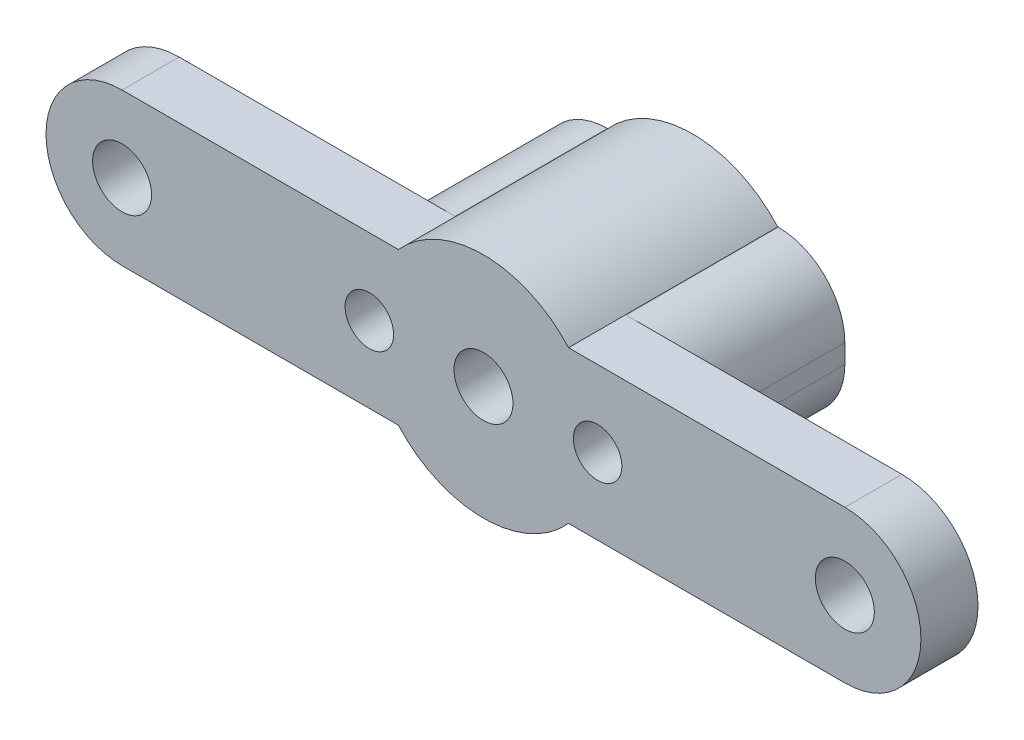
ISO-10303-21;
HEADER;
FILE_DESCRIPTION(('STEP AP214'),'2;1');
FILE_NAME('part.step','',(''),(''),'','','');
FILE_SCHEMA(('AUTOMOTIVE_DESIGN { 1 0 10303 214 1 1 1 1 }'));
ENDSEC;
DATA;
#1=APPLICATION_CONTEXT('core data for automotive mechanical design processes');
#2=APPLICATION_PROTOCOL_DEFINITION('international standard','automotive_design',2000,#1);
#3=PRODUCT_CONTEXT('',#1,'mechanical');
#4=PRODUCT('Part','Part','',(#3));
#5=PRODUCT_RELATED_PRODUCT_CATEGORY('part','',(#4));
#6=PRODUCT_DEFINITION_FORMATION('','',#4);
#7=PRODUCT_DEFINITION_CONTEXT('part definition',#1,'design');
#8=PRODUCT_DEFINITION('design','',#6,#7);
#9=PRODUCT_DEFINITION_SHAPE('','',#8);
#10=(LENGTH_UNIT() NAMED_UNIT(*) SI_UNIT(.MILLI.,.METRE.));
#11=(NAMED_UNIT(*) PLANE_ANGLE_UNIT() SI_UNIT($,.RADIAN.));
#12=(NAMED_UNIT(*) SI_UNIT($,.STERADIAN.) SOLID_ANGLE_UNIT());
#13=UNCERTAINTY_MEASURE_WITH_UNIT(LENGTH_MEASURE(1.E-05),#10,'distance_accuracy_value','');
#14=(GEOMETRIC_REPRESENTATION_CONTEXT(3) GLOBAL_UNCERTAINTY_ASSIGNED_CONTEXT((#13)) GLOBAL_UNIT_ASSIGNED_CONTEXT((#10,
#11,#12)) REPRESENTATION_CONTEXT('',''));
#15=CARTESIAN_POINT('',(0.,0.,0.));
#16=DIRECTION('',(0.,0.,1.));
#17=DIRECTION('',(1.,0.,0.));
#18=AXIS2_PLACEMENT_3D('',#15,#16,#17);
#19=CARTESIAN_POINT('',(-19.,0.,0.));
#20=DIRECTION('',(0.,0.,1.));
#21=DIRECTION('',(1.,0.,0.));
#22=AXIS2_PLACEMENT_3D('',#19,#20,#21);
#23=PLANE('',#22);
#24=CARTESIAN_POINT('',(-19.,0.,0.));
#25=DIRECTION('',(0.,0.,1.));
#26=DIRECTION('',(1.,0.,0.));
#27=AXIS2_PLACEMENT_3D('',#24,#25,#26);
#28=CIRCLE('',#27,1.55);
#29=CARTESIAN_POINT('',(-17.45,0.,0.));
#30=VERTEX_POINT('',#29);
#31=EDGE_CURVE('E315',#30,#30,#28,.T.);
#32=ORIENTED_EDGE('',*,*,#31,.T.);
#33=EDGE_LOOP('',(#32));
#34=FACE_BOUND('',#33,.T.);
#35=DIRECTION('',(0.,1.,0.));
#36=VECTOR('',#35,1.);
#37=CARTESIAN_POINT('',(-8.,4.,0.));
#38=LINE('',#37,#36);
#39=CARTESIAN_POINT('',(-8.,-0.5,0.));
#40=VERTEX_POINT('',#39);
#41=CARTESIAN_POINT('',(-8.,0.500000000000001,0.));
#42=VERTEX_POINT('',#41);
#43=EDGE_CURVE('E177',#40,#42,#38,.T.);
#44=ORIENTED_EDGE('',*,*,#43,.F.);
#45=CARTESIAN_POINT('',(-4.5,-0.5,0.));
#46=DIRECTION('',(0.,0.,1.));
#47=DIRECTION('',(1.,0.,0.));
#48=AXIS2_PLACEMENT_3D('',#45,#46,#47);
#49=CIRCLE('',#48,3.5);
#50=CARTESIAN_POINT('',(-4.5,-4.,0.));
#51=VERTEX_POINT('',#50);
#52=EDGE_CURVE('E217',#40,#51,#49,.T.);
#53=ORIENTED_EDGE('',*,*,#52,.T.);
#54=DIRECTION('',(1.,0.,0.));
#55=VECTOR('',#54,1.);
#56=CARTESIAN_POINT('',(-19.,-4.,0.));
#57=LINE('',#56,#55);
#58=CARTESIAN_POINT('',(-19.,-4.,0.));
#59=VERTEX_POINT('',#58);
#60=EDGE_CURVE('E223',#59,#51,#57,.T.);
#61=ORIENTED_EDGE('',*,*,#60,.F.);
#62=CARTESIAN_POINT('',(-19.,0.,0.));
#63=DIRECTION('',(0.,0.,1.));
#64=DIRECTION('',(1.,0.,0.));
#65=AXIS2_PLACEMENT_3D('',#62,#63,#64);
#66=CIRCLE('',#65,4.);
#67=CARTESIAN_POINT('',(-19.,4.,0.));
#68=VERTEX_POINT('',#67);
#69=EDGE_CURVE('E254',#68,#59,#66,.T.);
#70=ORIENTED_EDGE('',*,*,#69,.F.);
#71=DIRECTION('',(-1.,0.,0.));
#72=VECTOR('',#71,1.);
#73=CARTESIAN_POINT('',(-19.,4.,0.));
#74=LINE('',#73,#72);
#75=CARTESIAN_POINT('',(-4.5,4.,0.));
#76=VERTEX_POINT('',#75);
#77=EDGE_CURVE('E269',#76,#68,#74,.T.);
#78=ORIENTED_EDGE('',*,*,#77,.F.);
#79=CARTESIAN_POINT('',(-4.5,0.5,0.));
#80=DIRECTION('',(0.,0.,1.));
#81=DIRECTION('',(1.,0.,0.));
#82=AXIS2_PLACEMENT_3D('',#79,#80,#81);
#83=CIRCLE('',#82,3.5);
#84=EDGE_CURVE('E215',#76,#42,#83,.T.);
#85=ORIENTED_EDGE('',*,*,#84,.T.);
#86=EDGE_LOOP('',(#44,#53,#61,#70,#78,#85));
#87=FACE_BOUND('',#86,.T.);
#88=ADVANCED_FACE('F37',(#34,#87),#23,.F.);
#89=CARTESIAN_POINT('',(19.,0.,0.));
#90=DIRECTION('',(0.,0.,1.));
#91=DIRECTION('',(1.,0.,0.));
#92=AXIS2_PLACEMENT_3D('',#89,#90,#91);
#93=CIRCLE('',#92,1.55);
#94=CARTESIAN_POINT('',(20.55,0.,0.));
#95=VERTEX_POINT('',#94);
#96=EDGE_CURVE('E309',#95,#95,#93,.T.);
#97=ORIENTED_EDGE('',*,*,#96,.T.);
#98=EDGE_LOOP('',(#97));
#99=FACE_BOUND('',#98,.T.);
#100=DIRECTION('',(0.,-1.,0.));
#101=VECTOR('',#100,1.);
#102=CARTESIAN_POINT('',(8.,4.,0.));
#103=LINE('',#102,#101);
#104=CARTESIAN_POINT('',(8.,0.499999999999999,0.));
#105=VERTEX_POINT('',#104);
#106=CARTESIAN_POINT('',(8.,-0.5,0.));
#107=VERTEX_POINT('',#106);
#108=EDGE_CURVE('E180',#105,#107,#103,.T.);
#109=ORIENTED_EDGE('',*,*,#108,.F.);
#110=CARTESIAN_POINT('',(4.5,0.5,0.));
#111=DIRECTION('',(0.,0.,1.));
#112=DIRECTION('',(1.,0.,0.));
#113=AXIS2_PLACEMENT_3D('',#110,#111,#112);
#114=CIRCLE('',#113,3.5);
#115=CARTESIAN_POINT('',(4.5,4.,0.));
#116=VERTEX_POINT('',#115);
#117=EDGE_CURVE('E11',#105,#116,#114,.T.);
#118=ORIENTED_EDGE('',*,*,#117,.T.);
#119=DIRECTION('',(-1.,0.,0.));
#120=VECTOR('',#119,1.);
#121=CARTESIAN_POINT('',(4.47213595499958,4.,0.));
#122=LINE('',#121,#120);
#123=CARTESIAN_POINT('',(19.,4.,0.));
#124=VERTEX_POINT('',#123);
#125=EDGE_CURVE('E52',#124,#116,#122,.T.);
#126=ORIENTED_EDGE('',*,*,#125,.F.);
#127=CARTESIAN_POINT('',(19.,0.,0.));
#128=DIRECTION('',(0.,0.,1.));
#129=DIRECTION('',(1.,0.,0.));
#130=AXIS2_PLACEMENT_3D('',#127,#128,#129);
#131=CIRCLE('',#130,4.);
#132=CARTESIAN_POINT('',(19.,-4.,0.));
#133=VERTEX_POINT('',#132);
#134=EDGE_CURVE('E262',#133,#124,#131,.T.);
#135=ORIENTED_EDGE('',*,*,#134,.F.);
#136=DIRECTION('',(1.,0.,0.));
#137=VECTOR('',#136,1.);
#138=CARTESIAN_POINT('',(4.47213595499958,-4.,0.));
#139=LINE('',#138,#137);
#140=CARTESIAN_POINT('',(4.5,-4.,0.));
#141=VERTEX_POINT('',#140);
#142=EDGE_CURVE('E253',#141,#133,#139,.T.);
#143=ORIENTED_EDGE('',*,*,#142,.F.);
#144=CARTESIAN_POINT('',(4.5,-0.5,0.));
#145=DIRECTION('',(0.,0.,1.));
#146=DIRECTION('',(1.,0.,0.));
#147=AXIS2_PLACEMENT_3D('',#144,#145,#146);
#148=CIRCLE('',#147,3.5);
#149=EDGE_CURVE('E45',#141,#107,#148,.T.);
#150=ORIENTED_EDGE('',*,*,#149,.T.);
#151=EDGE_LOOP('',(#109,#118,#126,#135,#143,#150));
#152=FACE_BOUND('',#151,.T.);
#153=ADVANCED_FACE('F331',(#99,#152),#23,.F.);
#154=CARTESIAN_POINT('',(-19.,0.,3.));
#155=DIRECTION('',(0.,0.,1.));
#156=DIRECTION('',(1.,0.,0.));
#157=AXIS2_PLACEMENT_3D('',#154,#155,#156);
#158=PLANE('',#157);
#159=CARTESIAN_POINT('',(-6.,0.,3.));
#160=DIRECTION('',(0.,0.,1.));
#161=DIRECTION('',(1.,0.,0.));
#162=AXIS2_PLACEMENT_3D('',#159,#160,#161);
#163=CIRCLE('',#162,1.275);
#164=CARTESIAN_POINT('',(-4.725,0.,3.));
#165=VERTEX_POINT('',#164);
#166=EDGE_CURVE('E318',#165,#165,#163,.T.);
#167=ORIENTED_EDGE('',*,*,#166,.F.);
#168=EDGE_LOOP('',(#167));
#169=FACE_BOUND('',#168,.T.);
#170=CARTESIAN_POINT('',(19.,0.,3.));
#171=DIRECTION('',(0.,0.,1.));
#172=DIRECTION('',(1.,0.,0.));
#173=AXIS2_PLACEMENT_3D('',#170,#171,#172);
#174=CIRCLE('',#173,1.55);
#175=CARTESIAN_POINT('',(20.55,0.,3.));
#176=VERTEX_POINT('',#175);
#177=EDGE_CURVE('E308',#176,#176,#174,.T.);
#178=ORIENTED_EDGE('',*,*,#177,.F.);
#179=EDGE_LOOP('',(#178));
#180=FACE_BOUND('',#179,.T.);
#181=CARTESIAN_POINT('',(-19.,0.,3.));
#182=DIRECTION('',(0.,0.,1.));
#183=DIRECTION('',(1.,0.,0.));
#184=AXIS2_PLACEMENT_3D('',#181,#182,#183);
#185=CIRCLE('',#184,4.);
#186=CARTESIAN_POINT('',(-19.,4.,3.));
#187=VERTEX_POINT('',#186);
#188=CARTESIAN_POINT('',(-19.,-4.,3.));
#189=VERTEX_POINT('',#188);
#190=EDGE_CURVE('E271',#187,#189,#185,.T.);
#191=ORIENTED_EDGE('',*,*,#190,.T.);
#192=DIRECTION('',(1.,0.,0.));
#193=VECTOR('',#192,1.);
#194=CARTESIAN_POINT('',(-19.,-4.,3.));
#195=LINE('',#194,#193);
#196=CARTESIAN_POINT('',(-4.47213595499958,-4.,3.));
#197=VERTEX_POINT('',#196);
#198=EDGE_CURVE('E302',#189,#197,#195,.T.);
#199=ORIENTED_EDGE('',*,*,#198,.T.);
#200=CARTESIAN_POINT('',(0.,0.,3.));
#201=DIRECTION('',(0.,0.,1.));
#202=DIRECTION('',(1.,0.,0.));
#203=AXIS2_PLACEMENT_3D('',#200,#201,#202);
#204=CIRCLE('',#203,6.);
#205=CARTESIAN_POINT('',(4.47213595499958,-4.,3.));
#206=VERTEX_POINT('',#205);
#207=EDGE_CURVE('E300',#197,#206,#204,.T.);
#208=ORIENTED_EDGE('',*,*,#207,.T.);
#209=DIRECTION('',(1.,0.,0.));
#210=VECTOR('',#209,1.);
#211=CARTESIAN_POINT('',(4.47213595499958,-4.,3.));
#212=LINE('',#211,#210);
#213=CARTESIAN_POINT('',(19.,-4.,3.));
#214=VERTEX_POINT('',#213);
#215=EDGE_CURVE('E298',#206,#214,#212,.T.);
#216=ORIENTED_EDGE('',*,*,#215,.T.);
#217=CARTESIAN_POINT('',(19.,0.,3.));
#218=DIRECTION('',(0.,0.,1.));
#219=DIRECTION('',(1.,0.,0.));
#220=AXIS2_PLACEMENT_3D('',#217,#218,#219);
#221=CIRCLE('',#220,4.);
#222=CARTESIAN_POINT('',(19.,4.,3.));
#223=VERTEX_POINT('',#222);
#224=EDGE_CURVE('E296',#214,#223,#221,.T.);
#225=ORIENTED_EDGE('',*,*,#224,.T.);
#226=DIRECTION('',(-1.,0.,0.));
#227=VECTOR('',#226,1.);
#228=CARTESIAN_POINT('',(4.47213595499958,4.,3.));
#229=LINE('',#228,#227);
#230=CARTESIAN_POINT('',(4.47213595499958,4.,3.));
#231=VERTEX_POINT('',#230);
#232=EDGE_CURVE('E292',#223,#231,#229,.T.);
#233=ORIENTED_EDGE('',*,*,#232,.T.);
#234=CARTESIAN_POINT('',(0.,0.,3.));
#235=DIRECTION('',(0.,0.,1.));
#236=DIRECTION('',(1.,0.,0.));
#237=AXIS2_PLACEMENT_3D('',#234,#235,#236);
#238=CIRCLE('',#237,6.);
#239=CARTESIAN_POINT('',(-4.47213595499958,4.,3.));
#240=VERTEX_POINT('',#239);
#241=EDGE_CURVE('E157',#231,#240,#238,.T.);
#242=ORIENTED_EDGE('',*,*,#241,.T.);
#243=DIRECTION('',(-1.,0.,0.));
#244=VECTOR('',#243,1.);
#245=CARTESIAN_POINT('',(-19.,4.,3.));
#246=LINE('',#245,#244);
#247=EDGE_CURVE('E284',#240,#187,#246,.T.);
#248=ORIENTED_EDGE('',*,*,#247,.T.);
#249=EDGE_LOOP('',(#191,#199,#208,#216,#225,#233,#242,#248));
#250=FACE_BOUND('',#249,.T.);
#251=CARTESIAN_POINT('',(0.,0.,3.));
#252=DIRECTION('',(0.,0.,1.));
#253=DIRECTION('',(1.,0.,0.));
#254=AXIS2_PLACEMENT_3D('',#251,#252,#253);
#255=CIRCLE('',#254,1.55);
#256=CARTESIAN_POINT('',(1.55,0.,3.));
#257=VERTEX_POINT('',#256);
#258=EDGE_CURVE('E305',#257,#257,#255,.T.);
#259=ORIENTED_EDGE('',*,*,#258,.F.);
#260=EDGE_LOOP('',(#259));
#261=FACE_BOUND('',#260,.T.);
#262=CARTESIAN_POINT('',(-19.,0.,3.));
#263=DIRECTION('',(0.,0.,1.));
#264=DIRECTION('',(1.,0.,0.));
#265=AXIS2_PLACEMENT_3D('',#262,#263,#264);
#266=CIRCLE('',#265,1.55);
#267=CARTESIAN_POINT('',(-17.45,0.,3.));
#268=VERTEX_POINT('',#267);
#269=EDGE_CURVE('E312',#268,#268,#266,.T.);
#270=ORIENTED_EDGE('',*,*,#269,.F.);
#271=EDGE_LOOP('',(#270));
#272=FACE_BOUND('',#271,.T.);
#273=CARTESIAN_POINT('',(6.,0.,3.));
#274=DIRECTION('',(0.,0.,1.));
#275=DIRECTION('',(1.,0.,0.));
#276=AXIS2_PLACEMENT_3D('',#273,#274,#275);
#277=CIRCLE('',#276,1.275);
#278=CARTESIAN_POINT('',(7.275,0.,3.));
#279=VERTEX_POINT('',#278);
#280=EDGE_CURVE('E199',#279,#279,#277,.T.);
#281=ORIENTED_EDGE('',*,*,#280,.F.);
#282=EDGE_LOOP('',(#281));
#283=FACE_BOUND('',#282,.T.);
#284=ADVANCED_FACE('F328',(#169,#180,#250,#261,#272,#283),#158,.T.);
#285=CARTESIAN_POINT('',(-19.,0.,3.));
#286=DIRECTION('',(0.,0.,-1.));
#287=DIRECTION('',(-1.,0.,0.));
#288=AXIS2_PLACEMENT_3D('',#285,#286,#287);
#289=CYLINDRICAL_SURFACE('',#288,4.);
#290=ORIENTED_EDGE('',*,*,#69,.T.);
#291=DIRECTION('',(0.,0.,-1.));
#292=VECTOR('',#291,1.);
#293=CARTESIAN_POINT('',(-19.,-4.,3.));
#294=LINE('',#293,#292);
#295=EDGE_CURVE('E250',#189,#59,#294,.T.);
#296=ORIENTED_EDGE('',*,*,#295,.F.);
#297=ORIENTED_EDGE('',*,*,#190,.F.);
#298=DIRECTION('',(0.,0.,-1.));
#299=VECTOR('',#298,1.);
#300=CARTESIAN_POINT('',(-19.,4.,3.));
#301=LINE('',#300,#299);
#302=EDGE_CURVE('E282',#187,#68,#301,.T.);
#303=ORIENTED_EDGE('',*,*,#302,.T.);
#304=EDGE_LOOP('',(#290,#296,#297,#303));
#305=FACE_BOUND('',#304,.T.);
#306=ADVANCED_FACE('F330',(#305),#289,.T.);
#307=CARTESIAN_POINT('',(-19.,-4.,3.));
#308=DIRECTION('',(0.,1.,0.));
#309=DIRECTION('',(0.,0.,1.));
#310=AXIS2_PLACEMENT_3D('',#307,#308,#309);
#311=PLANE('',#310);
#312=ORIENTED_EDGE('',*,*,#60,.T.);
#313=DIRECTION('',(0.,0.,1.));
#314=VECTOR('',#313,1.);
#315=CARTESIAN_POINT('',(-4.5,-4.,3.));
#316=LINE('',#315,#314);
#317=CARTESIAN_POINT('',(-4.5,-4.,-8.));
#318=VERTEX_POINT('',#317);
#319=EDGE_CURVE('E229',#51,#318,#316,.F.);
#320=ORIENTED_EDGE('',*,*,#319,.T.);
#321=DIRECTION('',(-1.,0.,0.));
#322=VECTOR('',#321,1.);
#323=CARTESIAN_POINT('',(-4.47213595499958,-4.,-8.));
#324=LINE('',#323,#322);
#325=CARTESIAN_POINT('',(-4.47213595499958,-4.,-8.));
#326=VERTEX_POINT('',#325);
#327=EDGE_CURVE('E193',#326,#318,#324,.T.);
#328=ORIENTED_EDGE('',*,*,#327,.F.);
#329=DIRECTION('',(0.,0.,-1.));
#330=VECTOR('',#329,1.);
#331=CARTESIAN_POINT('',(-4.47213595499958,-4.,3.));
#332=LINE('',#331,#330);
#333=EDGE_CURVE('E273',#197,#326,#332,.T.);
#334=ORIENTED_EDGE('',*,*,#333,.F.);
#335=ORIENTED_EDGE('',*,*,#198,.F.);
#336=ORIENTED_EDGE('',*,*,#295,.T.);
#337=EDGE_LOOP('',(#312,#320,#328,#334,#335,#336));
#338=FACE_BOUND('',#337,.T.);
#339=ADVANCED_FACE('F338',(#338),#311,.F.);
#340=CARTESIAN_POINT('',(0.,0.,3.));
#341=DIRECTION('',(0.,0.,-1.));
#342=DIRECTION('',(-1.,0.,0.));
#343=AXIS2_PLACEMENT_3D('',#340,#341,#342);
#344=CYLINDRICAL_SURFACE('',#343,6.);
#345=ORIENTED_EDGE('',*,*,#333,.T.);
#346=CARTESIAN_POINT('',(0.,0.,-8.));
#347=DIRECTION('',(0.,0.,-1.));
#348=DIRECTION('',(-1.,0.,0.));
#349=AXIS2_PLACEMENT_3D('',#346,#347,#348);
#350=CIRCLE('',#349,6.);
#351=CARTESIAN_POINT('',(4.47213595499958,-4.,-8.));
#352=VERTEX_POINT('',#351);
#353=EDGE_CURVE('E190',#352,#326,#350,.T.);
#354=ORIENTED_EDGE('',*,*,#353,.F.);
#355=DIRECTION('',(0.,0.,-1.));
#356=VECTOR('',#355,1.);
#357=CARTESIAN_POINT('',(4.47213595499958,-4.,3.));
#358=LINE('',#357,#356);
#359=EDGE_CURVE('E275',#206,#352,#358,.T.);
#360=ORIENTED_EDGE('',*,*,#359,.F.);
#361=ORIENTED_EDGE('',*,*,#207,.F.);
#362=EDGE_LOOP('',(#345,#354,#360,#361));
#363=FACE_BOUND('',#362,.T.);
#364=ADVANCED_FACE('F366',(#363),#344,.T.);
#365=CARTESIAN_POINT('',(4.47213595499958,-4.,3.));
#366=DIRECTION('',(0.,1.,0.));
#367=DIRECTION('',(0.,0.,1.));
#368=AXIS2_PLACEMENT_3D('',#365,#366,#367);
#369=PLANE('',#368);
#370=DIRECTION('',(-1.,0.,0.));
#371=VECTOR('',#370,1.);
#372=CARTESIAN_POINT('',(8.,-4.,-8.));
#373=LINE('',#372,#371);
#374=CARTESIAN_POINT('',(4.5,-4.,-8.));
#375=VERTEX_POINT('',#374);
#376=EDGE_CURVE('E188',#375,#352,#373,.T.);
#377=ORIENTED_EDGE('',*,*,#376,.F.);
#378=DIRECTION('',(0.,0.,1.));
#379=VECTOR('',#378,1.);
#380=CARTESIAN_POINT('',(4.5,-4.,3.));
#381=LINE('',#380,#379);
#382=EDGE_CURVE('E207',#375,#141,#381,.T.);
#383=ORIENTED_EDGE('',*,*,#382,.T.);
#384=ORIENTED_EDGE('',*,*,#142,.T.);
#385=DIRECTION('',(0.,0.,-1.));
#386=VECTOR('',#385,1.);
#387=CARTESIAN_POINT('',(19.,-4.,3.));
#388=LINE('',#387,#386);
#389=EDGE_CURVE('E278',#214,#133,#388,.T.);
#390=ORIENTED_EDGE('',*,*,#389,.F.);
#391=ORIENTED_EDGE('',*,*,#215,.F.);
#392=ORIENTED_EDGE('',*,*,#359,.T.);
#393=EDGE_LOOP('',(#377,#383,#384,#390,#391,#392));
#394=FACE_BOUND('',#393,.T.);
#395=ADVANCED_FACE('F362',(#394),#369,.F.);
#396=CARTESIAN_POINT('',(19.,0.,3.));
#397=DIRECTION('',(0.,0.,-1.));
#398=DIRECTION('',(-1.,0.,0.));
#399=AXIS2_PLACEMENT_3D('',#396,#397,#398);
#400=CYLINDRICAL_SURFACE('',#399,4.);
#401=ORIENTED_EDGE('',*,*,#134,.T.);
#402=DIRECTION('',(0.,0.,-1.));
#403=VECTOR('',#402,1.);
#404=CARTESIAN_POINT('',(19.,4.,3.));
#405=LINE('',#404,#403);
#406=EDGE_CURVE('E159',#223,#124,#405,.T.);
#407=ORIENTED_EDGE('',*,*,#406,.F.);
#408=ORIENTED_EDGE('',*,*,#224,.F.);
#409=ORIENTED_EDGE('',*,*,#389,.T.);
#410=EDGE_LOOP('',(#401,#407,#408,#409));
#411=FACE_BOUND('',#410,.T.);
#412=ADVANCED_FACE('F359',(#411),#400,.T.);
#413=CARTESIAN_POINT('',(4.47213595499958,4.,3.));
#414=DIRECTION('',(0.,-1.,0.));
#415=DIRECTION('',(1.,0.,0.));
#416=AXIS2_PLACEMENT_3D('',#413,#414,#415);
#417=PLANE('',#416);
#418=ORIENTED_EDGE('',*,*,#125,.T.);
#419=DIRECTION('',(0.,0.,1.));
#420=VECTOR('',#419,1.);
#421=CARTESIAN_POINT('',(4.5,4.,3.));
#422=LINE('',#421,#420);
#423=CARTESIAN_POINT('',(4.5,4.,-8.));
#424=VERTEX_POINT('',#423);
#425=EDGE_CURVE('E166',#116,#424,#422,.F.);
#426=ORIENTED_EDGE('',*,*,#425,.T.);
#427=DIRECTION('',(1.,0.,0.));
#428=VECTOR('',#427,1.);
#429=CARTESIAN_POINT('',(8.,4.,-8.));
#430=LINE('',#429,#428);
#431=CARTESIAN_POINT('',(4.47213595499958,4.,-8.));
#432=VERTEX_POINT('',#431);
#433=EDGE_CURVE('E163',#432,#424,#430,.T.);
#434=ORIENTED_EDGE('',*,*,#433,.F.);
#435=DIRECTION('',(0.,0.,-1.));
#436=VECTOR('',#435,1.);
#437=CARTESIAN_POINT('',(4.47213595499958,4.,3.));
#438=LINE('',#437,#436);
#439=EDGE_CURVE('E151',#231,#432,#438,.T.);
#440=ORIENTED_EDGE('',*,*,#439,.F.);
#441=ORIENTED_EDGE('',*,*,#232,.F.);
#442=ORIENTED_EDGE('',*,*,#406,.T.);
#443=EDGE_LOOP('',(#418,#426,#434,#440,#441,#442));
#444=FACE_BOUND('',#443,.T.);
#445=ADVANCED_FACE('F164',(#444),#417,.F.);
#446=CARTESIAN_POINT('',(0.,0.,3.));
#447=DIRECTION('',(0.,0.,-1.));
#448=DIRECTION('',(-1.,0.,0.));
#449=AXIS2_PLACEMENT_3D('',#446,#447,#448);
#450=CYLINDRICAL_SURFACE('',#449,6.);
#451=ORIENTED_EDGE('',*,*,#439,.T.);
#452=CARTESIAN_POINT('',(0.,0.,-8.));
#453=DIRECTION('',(0.,0.,-1.));
#454=DIRECTION('',(-1.,0.,0.));
#455=AXIS2_PLACEMENT_3D('',#452,#453,#454);
#456=CIRCLE('',#455,6.);
#457=CARTESIAN_POINT('',(-4.47213595499958,4.,-8.));
#458=VERTEX_POINT('',#457);
#459=EDGE_CURVE('E156',#458,#432,#456,.T.);
#460=ORIENTED_EDGE('',*,*,#459,.F.);
#461=DIRECTION('',(0.,0.,-1.));
#462=VECTOR('',#461,1.);
#463=CARTESIAN_POINT('',(-4.47213595499958,4.,3.));
#464=LINE('',#463,#462);
#465=EDGE_CURVE('E160',#240,#458,#464,.T.);
#466=ORIENTED_EDGE('',*,*,#465,.F.);
#467=ORIENTED_EDGE('',*,*,#241,.F.);
#468=EDGE_LOOP('',(#451,#460,#466,#467));
#469=FACE_BOUND('',#468,.T.);
#470=ADVANCED_FACE('F153',(#469),#450,.T.);
#471=CARTESIAN_POINT('',(-19.,4.,3.));
#472=DIRECTION('',(0.,-1.,0.));
#473=DIRECTION('',(0.,0.,-1.));
#474=AXIS2_PLACEMENT_3D('',#471,#472,#473);
#475=PLANE('',#474);
#476=DIRECTION('',(1.,0.,0.));
#477=VECTOR('',#476,1.);
#478=CARTESIAN_POINT('',(-4.47213595499958,4.,-8.));
#479=LINE('',#478,#477);
#480=CARTESIAN_POINT('',(-4.5,4.,-8.));
#481=VERTEX_POINT('',#480);
#482=EDGE_CURVE('E175',#481,#458,#479,.T.);
#483=ORIENTED_EDGE('',*,*,#482,.F.);
#484=DIRECTION('',(0.,0.,1.));
#485=VECTOR('',#484,1.);
#486=CARTESIAN_POINT('',(-4.5,4.,3.));
#487=LINE('',#486,#485);
#488=EDGE_CURVE('E246',#481,#76,#487,.T.);
#489=ORIENTED_EDGE('',*,*,#488,.T.);
#490=ORIENTED_EDGE('',*,*,#77,.T.);
#491=ORIENTED_EDGE('',*,*,#302,.F.);
#492=ORIENTED_EDGE('',*,*,#247,.F.);
#493=ORIENTED_EDGE('',*,*,#465,.T.);
#494=EDGE_LOOP('',(#483,#489,#490,#491,#492,#493));
#495=FACE_BOUND('',#494,.T.);
#496=ADVANCED_FACE('F350',(#495),#475,.F.);
#497=CARTESIAN_POINT('',(0.,0.,3.));
#498=DIRECTION('',(0.,0.,-1.));
#499=DIRECTION('',(-1.,0.,0.));
#500=AXIS2_PLACEMENT_3D('',#497,#498,#499);
#501=CYLINDRICAL_SURFACE('',#500,1.55);
#502=ORIENTED_EDGE('',*,*,#258,.T.);
#503=EDGE_LOOP('',(#502));
#504=FACE_BOUND('',#503,.T.);
#505=CARTESIAN_POINT('',(0.,0.,-8.));
#506=DIRECTION('',(0.,0.,-1.));
#507=DIRECTION('',(-1.,0.,0.));
#508=AXIS2_PLACEMENT_3D('',#505,#506,#507);
#509=CIRCLE('',#508,1.55);
#510=CARTESIAN_POINT('',(-1.55,0.,-8.));
#511=VERTEX_POINT('',#510);
#512=EDGE_CURVE('E183',#511,#511,#509,.T.);
#513=ORIENTED_EDGE('',*,*,#512,.T.);
#514=EDGE_LOOP('',(#513));
#515=FACE_BOUND('',#514,.T.);
#516=ADVANCED_FACE('F353',(#504,#515),#501,.F.);
#517=CARTESIAN_POINT('',(19.,0.,3.));
#518=DIRECTION('',(0.,0.,-1.));
#519=DIRECTION('',(-1.,0.,0.));
#520=AXIS2_PLACEMENT_3D('',#517,#518,#519);
#521=CYLINDRICAL_SURFACE('',#520,1.55);
#522=ORIENTED_EDGE('',*,*,#177,.T.);
#523=EDGE_LOOP('',(#522));
#524=FACE_BOUND('',#523,.T.);
#525=ORIENTED_EDGE('',*,*,#96,.F.);
#526=EDGE_LOOP('',(#525));
#527=FACE_BOUND('',#526,.T.);
#528=ADVANCED_FACE('F424',(#524,#527),#521,.F.);
#529=CARTESIAN_POINT('',(-19.,0.,3.));
#530=DIRECTION('',(0.,0.,-1.));
#531=DIRECTION('',(-1.,0.,0.));
#532=AXIS2_PLACEMENT_3D('',#529,#530,#531);
#533=CYLINDRICAL_SURFACE('',#532,1.55);
#534=ORIENTED_EDGE('',*,*,#269,.T.);
#535=EDGE_LOOP('',(#534));
#536=FACE_BOUND('',#535,.T.);
#537=ORIENTED_EDGE('',*,*,#31,.F.);
#538=EDGE_LOOP('',(#537));
#539=FACE_BOUND('',#538,.T.);
#540=ADVANCED_FACE('F420',(#536,#539),#533,.F.);
#541=CARTESIAN_POINT('',(-6.,0.,3.));
#542=DIRECTION('',(0.,0.,-1.));
#543=DIRECTION('',(-1.,0.,0.));
#544=AXIS2_PLACEMENT_3D('',#541,#542,#543);
#545=CYLINDRICAL_SURFACE('',#544,1.275);
#546=ORIENTED_EDGE('',*,*,#166,.T.);
#547=EDGE_LOOP('',(#546));
#548=FACE_BOUND('',#547,.T.);
#549=CARTESIAN_POINT('',(-6.,0.,-8.));
#550=DIRECTION('',(0.,0.,-1.));
#551=DIRECTION('',(-1.,0.,0.));
#552=AXIS2_PLACEMENT_3D('',#549,#550,#551);
#553=CIRCLE('',#552,1.275);
#554=CARTESIAN_POINT('',(-7.275,0.,-8.));
#555=VERTEX_POINT('',#554);
#556=EDGE_CURVE('E438',#555,#555,#553,.T.);
#557=ORIENTED_EDGE('',*,*,#556,.T.);
#558=EDGE_LOOP('',(#557));
#559=FACE_BOUND('',#558,.T.);
#560=ADVANCED_FACE('F417',(#548,#559),#545,.F.);
#561=CARTESIAN_POINT('',(6.,0.,3.));
#562=DIRECTION('',(0.,0.,-1.));
#563=DIRECTION('',(-1.,0.,0.));
#564=AXIS2_PLACEMENT_3D('',#561,#562,#563);
#565=CYLINDRICAL_SURFACE('',#564,1.275);
#566=ORIENTED_EDGE('',*,*,#280,.T.);
#567=EDGE_LOOP('',(#566));
#568=FACE_BOUND('',#567,.T.);
#569=CARTESIAN_POINT('',(6.,0.,-8.));
#570=DIRECTION('',(0.,0.,-1.));
#571=DIRECTION('',(-1.,0.,0.));
#572=AXIS2_PLACEMENT_3D('',#569,#570,#571);
#573=CIRCLE('',#572,1.275);
#574=CARTESIAN_POINT('',(4.725,0.,-8.));
#575=VERTEX_POINT('',#574);
#576=EDGE_CURVE('E436',#575,#575,#573,.T.);
#577=ORIENTED_EDGE('',*,*,#576,.T.);
#578=EDGE_LOOP('',(#577));
#579=FACE_BOUND('',#578,.T.);
#580=ADVANCED_FACE('F325',(#568,#579),#565,.F.);
#581=CARTESIAN_POINT('',(0.,0.,-8.));
#582=DIRECTION('',(0.,0.,-1.));
#583=DIRECTION('',(-1.,0.,0.));
#584=AXIS2_PLACEMENT_3D('',#581,#582,#583);
#585=PLANE('',#584);
#586=ORIENTED_EDGE('',*,*,#576,.F.);
#587=EDGE_LOOP('',(#586));
#588=FACE_BOUND('',#587,.T.);
#589=DIRECTION('',(0.,1.,0.));
#590=VECTOR('',#589,1.);
#591=CARTESIAN_POINT('',(-8.,4.,-8.));
#592=LINE('',#591,#590);
#593=CARTESIAN_POINT('',(-8.,-0.5,-8.));
#594=VERTEX_POINT('',#593);
#595=CARTESIAN_POINT('',(-8.,0.500000000000001,-8.));
#596=VERTEX_POINT('',#595);
#597=EDGE_CURVE('E196',#594,#596,#592,.T.);
#598=ORIENTED_EDGE('',*,*,#597,.T.);
#599=CARTESIAN_POINT('',(-4.5,0.5,-8.));
#600=DIRECTION('',(0.,0.,-1.));
#601=DIRECTION('',(-1.,0.,0.));
#602=AXIS2_PLACEMENT_3D('',#599,#600,#601);
#603=CIRCLE('',#602,3.5);
#604=EDGE_CURVE('E234',#596,#481,#603,.T.);
#605=ORIENTED_EDGE('',*,*,#604,.T.);
#606=ORIENTED_EDGE('',*,*,#482,.T.);
#607=ORIENTED_EDGE('',*,*,#459,.T.);
#608=ORIENTED_EDGE('',*,*,#433,.T.);
#609=CARTESIAN_POINT('',(4.5,0.5,-8.));
#610=DIRECTION('',(0.,0.,-1.));
#611=DIRECTION('',(-1.,0.,0.));
#612=AXIS2_PLACEMENT_3D('',#609,#610,#611);
#613=CIRCLE('',#612,3.5);
#614=CARTESIAN_POINT('',(8.,0.499999999999999,-8.));
#615=VERTEX_POINT('',#614);
#616=EDGE_CURVE('E241',#424,#615,#613,.T.);
#617=ORIENTED_EDGE('',*,*,#616,.T.);
#618=DIRECTION('',(0.,-1.,0.));
#619=VECTOR('',#618,1.);
#620=CARTESIAN_POINT('',(8.,4.,-8.));
#621=LINE('',#620,#619);
#622=CARTESIAN_POINT('',(8.,-0.5,-8.));
#623=VERTEX_POINT('',#622);
#624=EDGE_CURVE('E169',#615,#623,#621,.T.);
#625=ORIENTED_EDGE('',*,*,#624,.T.);
#626=CARTESIAN_POINT('',(4.5,-0.5,-8.));
#627=DIRECTION('',(0.,0.,-1.));
#628=DIRECTION('',(-1.,0.,0.));
#629=AXIS2_PLACEMENT_3D('',#626,#627,#628);
#630=CIRCLE('',#629,3.5);
#631=EDGE_CURVE('E239',#623,#375,#630,.T.);
#632=ORIENTED_EDGE('',*,*,#631,.T.);
#633=ORIENTED_EDGE('',*,*,#376,.T.);
#634=ORIENTED_EDGE('',*,*,#353,.T.);
#635=ORIENTED_EDGE('',*,*,#327,.T.);
#636=CARTESIAN_POINT('',(-4.5,-0.5,-8.));
#637=DIRECTION('',(0.,0.,-1.));
#638=DIRECTION('',(-1.,0.,0.));
#639=AXIS2_PLACEMENT_3D('',#636,#637,#638);
#640=CIRCLE('',#639,3.5);
#641=EDGE_CURVE('E231',#318,#594,#640,.T.);
#642=ORIENTED_EDGE('',*,*,#641,.T.);
#643=EDGE_LOOP('',(#598,#605,#606,#607,#608,#617,#625,#632,#633,#634,#635,#642));
#644=FACE_BOUND('',#643,.T.);
#645=ORIENTED_EDGE('',*,*,#512,.F.);
#646=EDGE_LOOP('',(#645));
#647=FACE_BOUND('',#646,.T.);
#648=ORIENTED_EDGE('',*,*,#556,.F.);
#649=EDGE_LOOP('',(#648));
#650=FACE_BOUND('',#649,.T.);
#651=ADVANCED_FACE('F172',(#588,#644,#647,#650),#585,.T.);
#652=CARTESIAN_POINT('',(8.,4.,-8.));
#653=DIRECTION('',(-1.,0.,0.));
#654=DIRECTION('',(0.,-1.,0.));
#655=AXIS2_PLACEMENT_3D('',#652,#653,#654);
#656=PLANE('',#655);
#657=ORIENTED_EDGE('',*,*,#108,.T.);
#658=DIRECTION('',(0.,0.,1.));
#659=VECTOR('',#658,1.);
#660=CARTESIAN_POINT('',(8.,-0.5,-8.));
#661=LINE('',#660,#659);
#662=EDGE_CURVE('E212',#107,#623,#661,.F.);
#663=ORIENTED_EDGE('',*,*,#662,.T.);
#664=ORIENTED_EDGE('',*,*,#624,.F.);
#665=DIRECTION('',(0.,0.,1.));
#666=VECTOR('',#665,1.);
#667=CARTESIAN_POINT('',(8.,0.499999999999999,-8.));
#668=LINE('',#667,#666);
#669=EDGE_CURVE('E209',#615,#105,#668,.T.);
#670=ORIENTED_EDGE('',*,*,#669,.T.);
#671=EDGE_LOOP('',(#657,#663,#664,#670));
#672=FACE_BOUND('',#671,.T.);
#673=ADVANCED_FACE('F406',(#672),#656,.F.);
#674=CARTESIAN_POINT('',(-8.,4.,-8.));
#675=DIRECTION('',(1.,0.,0.));
#676=DIRECTION('',(0.,1.,0.));
#677=AXIS2_PLACEMENT_3D('',#674,#675,#676);
#678=PLANE('',#677);
#679=ORIENTED_EDGE('',*,*,#43,.T.);
#680=DIRECTION('',(0.,0.,1.));
#681=VECTOR('',#680,1.);
#682=CARTESIAN_POINT('',(-8.,0.500000000000001,-8.));
#683=LINE('',#682,#681);
#684=EDGE_CURVE('E243',#42,#596,#683,.F.);
#685=ORIENTED_EDGE('',*,*,#684,.T.);
#686=ORIENTED_EDGE('',*,*,#597,.F.);
#687=DIRECTION('',(0.,0.,1.));
#688=VECTOR('',#687,1.);
#689=CARTESIAN_POINT('',(-8.,-0.5,-8.));
#690=LINE('',#689,#688);
#691=EDGE_CURVE('E245',#594,#40,#690,.T.);
#692=ORIENTED_EDGE('',*,*,#691,.T.);
#693=EDGE_LOOP('',(#679,#685,#686,#692));
#694=FACE_BOUND('',#693,.T.);
#695=ADVANCED_FACE('F376',(#694),#678,.F.);
#696=CARTESIAN_POINT('',(-4.5,0.5,3.));
#697=DIRECTION('',(0.,0.,1.));
#698=DIRECTION('',(1.,0.,0.));
#699=AXIS2_PLACEMENT_3D('',#696,#697,#698);
#700=CYLINDRICAL_SURFACE('',#699,3.5);
#701=ORIENTED_EDGE('',*,*,#604,.F.);
#702=ORIENTED_EDGE('',*,*,#684,.F.);
#703=ORIENTED_EDGE('',*,*,#84,.F.);
#704=ORIENTED_EDGE('',*,*,#488,.F.);
#705=EDGE_LOOP('',(#701,#702,#703,#704));
#706=FACE_BOUND('',#705,.T.);
#707=ADVANCED_FACE('F373',(#706),#700,.T.);
#708=CARTESIAN_POINT('',(-4.5,-0.5,-8.));
#709=DIRECTION('',(0.,0.,1.));
#710=DIRECTION('',(1.,0.,0.));
#711=AXIS2_PLACEMENT_3D('',#708,#709,#710);
#712=CYLINDRICAL_SURFACE('',#711,3.5);
#713=ORIENTED_EDGE('',*,*,#641,.F.);
#714=ORIENTED_EDGE('',*,*,#319,.F.);
#715=ORIENTED_EDGE('',*,*,#52,.F.);
#716=ORIENTED_EDGE('',*,*,#691,.F.);
#717=EDGE_LOOP('',(#713,#714,#715,#716));
#718=FACE_BOUND('',#717,.T.);
#719=ADVANCED_FACE('F230',(#718),#712,.T.);
#720=CARTESIAN_POINT('',(4.5,-0.5,3.));
#721=DIRECTION('',(0.,0.,1.));
#722=DIRECTION('',(1.,0.,0.));
#723=AXIS2_PLACEMENT_3D('',#720,#721,#722);
#724=CYLINDRICAL_SURFACE('',#723,3.5);
#725=ORIENTED_EDGE('',*,*,#631,.F.);
#726=ORIENTED_EDGE('',*,*,#662,.F.);
#727=ORIENTED_EDGE('',*,*,#149,.F.);
#728=ORIENTED_EDGE('',*,*,#382,.F.);
#729=EDGE_LOOP('',(#725,#726,#727,#728));
#730=FACE_BOUND('',#729,.T.);
#731=ADVANCED_FACE('F379',(#730),#724,.T.);
#732=CARTESIAN_POINT('',(4.5,0.5,-8.));
#733=DIRECTION('',(0.,0.,1.));
#734=DIRECTION('',(1.,0.,0.));
#735=AXIS2_PLACEMENT_3D('',#732,#733,#734);
#736=CYLINDRICAL_SURFACE('',#735,3.5);
#737=ORIENTED_EDGE('',*,*,#616,.F.);
#738=ORIENTED_EDGE('',*,*,#425,.F.);
#739=ORIENTED_EDGE('',*,*,#117,.F.);
#740=ORIENTED_EDGE('',*,*,#669,.F.);
#741=EDGE_LOOP('',(#737,#738,#739,#740));
#742=FACE_BOUND('',#741,.T.);
#743=ADVANCED_FACE('F39',(#742),#736,.T.);
#744=CLOSED_SHELL('',(#88,#153,#284,#306,#339,#364,#395,#412,#445,#470,#496,#516,#528,#540,#560,
#580,#651,#673,#695,#707,#719,#731,#743));
#745=MANIFOLD_SOLID_BREP('B2',#744);
#746=ADVANCED_BREP_SHAPE_REPRESENTATION('',(#18,#745),#14);
#747=SHAPE_DEFINITION_REPRESENTATION(#9,#746);
ENDSEC;
END-ISO-10303-21;
